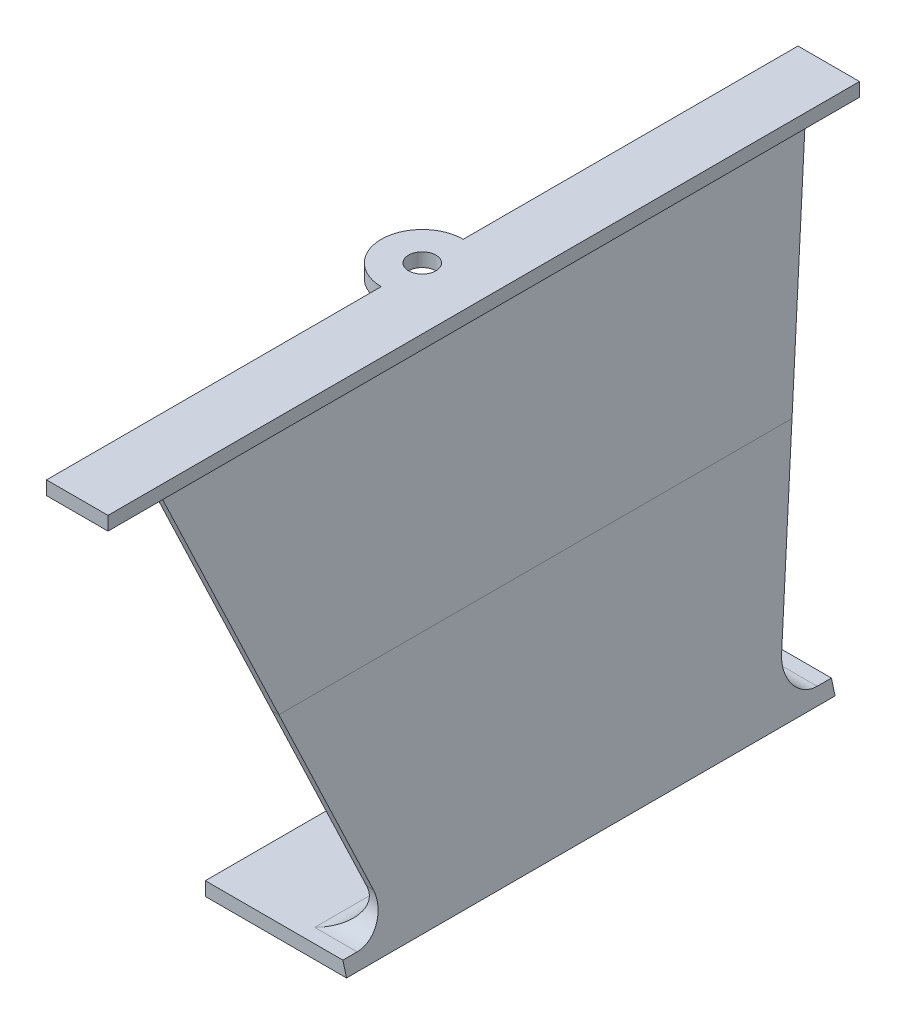
ISO-10303-21;
HEADER;
FILE_DESCRIPTION(('STEP AP214'),'2;1');
FILE_NAME('part.step','',(''),(''),'','','');
FILE_SCHEMA(('AUTOMOTIVE_DESIGN { 1 0 10303 214 1 1 1 1 }'));
ENDSEC;
DATA;
#1=APPLICATION_CONTEXT('core data for automotive mechanical design processes');
#2=APPLICATION_PROTOCOL_DEFINITION('international standard','automotive_design',2000,#1);
#3=PRODUCT_CONTEXT('',#1,'mechanical');
#4=PRODUCT('Part','Part','',(#3));
#5=PRODUCT_RELATED_PRODUCT_CATEGORY('part','',(#4));
#6=PRODUCT_DEFINITION_FORMATION('','',#4);
#7=PRODUCT_DEFINITION_CONTEXT('part definition',#1,'design');
#8=PRODUCT_DEFINITION('design','',#6,#7);
#9=PRODUCT_DEFINITION_SHAPE('','',#8);
#10=(LENGTH_UNIT() NAMED_UNIT(*) SI_UNIT(.MILLI.,.METRE.));
#11=(NAMED_UNIT(*) PLANE_ANGLE_UNIT() SI_UNIT($,.RADIAN.));
#12=(NAMED_UNIT(*) SI_UNIT($,.STERADIAN.) SOLID_ANGLE_UNIT());
#13=UNCERTAINTY_MEASURE_WITH_UNIT(LENGTH_MEASURE(1.E-05),#10,'distance_accuracy_value','');
#14=(GEOMETRIC_REPRESENTATION_CONTEXT(3) GLOBAL_UNCERTAINTY_ASSIGNED_CONTEXT((#13)) GLOBAL_UNIT_ASSIGNED_CONTEXT((#10,
#11,#12)) REPRESENTATION_CONTEXT('',''));
#15=CARTESIAN_POINT('',(0.,0.,0.));
#16=DIRECTION('',(0.,0.,1.));
#17=DIRECTION('',(1.,0.,0.));
#18=AXIS2_PLACEMENT_3D('',#15,#16,#17);
#19=CARTESIAN_POINT('',(0.,-70.5249999999999,0.));
#20=DIRECTION('',(0.,1.,0.));
#21=DIRECTION('',(0.,0.,1.));
#22=AXIS2_PLACEMENT_3D('',#19,#20,#21);
#23=PLANE('',#22);
#24=DIRECTION('',(0.,0.,-1.));
#25=VECTOR('',#24,1.);
#26=CARTESIAN_POINT('',(-42.0830751454981,-70.5249999999999,-43.3304000000001));
#27=LINE('',#26,#25);
#28=CARTESIAN_POINT('',(-42.0830751454981,-70.5249999999999,141.072171653543));
#29=VERTEX_POINT('',#28);
#30=CARTESIAN_POINT('',(-42.0830751454981,-70.5249999999999,-46.6671716535434));
#31=VERTEX_POINT('',#30);
#32=EDGE_CURVE('E202',#29,#31,#27,.T.);
#33=ORIENTED_EDGE('',*,*,#32,.T.);
#34=DIRECTION('',(-1.,0.,0.));
#35=VECTOR('',#34,1.);
#36=CARTESIAN_POINT('',(0.,-70.5249999999999,-46.6671716535434));
#37=LINE('',#36,#35);
#38=CARTESIAN_POINT('',(-44.5830751454981,-70.5249999999999,-46.6671716535434));
#39=VERTEX_POINT('',#38);
#40=EDGE_CURVE('E200',#31,#39,#37,.T.);
#41=ORIENTED_EDGE('',*,*,#40,.T.);
#42=DIRECTION('',(0.,0.,-1.));
#43=VECTOR('',#42,1.);
#44=CARTESIAN_POINT('',(-44.5830751454981,-70.5249999999999,0.));
#45=LINE('',#44,#43);
#46=CARTESIAN_POINT('',(-44.5830751454981,-70.5249999999999,141.072171653543));
#47=VERTEX_POINT('',#46);
#48=EDGE_CURVE('E197',#47,#39,#45,.T.);
#49=ORIENTED_EDGE('',*,*,#48,.F.);
#50=DIRECTION('',(-1.,0.,0.));
#51=VECTOR('',#50,1.);
#52=CARTESIAN_POINT('',(0.,-70.5249999999999,141.072171653543));
#53=LINE('',#52,#51);
#54=EDGE_CURVE('E194',#29,#47,#53,.T.);
#55=ORIENTED_EDGE('',*,*,#54,.F.);
#56=EDGE_LOOP('',(#33,#41,#49,#55));
#57=FACE_BOUND('',#56,.T.);
#58=ADVANCED_FACE('F73',(#57),#23,.T.);
#59=CARTESIAN_POINT('',(0.,-141.05,0.));
#60=DIRECTION('',(0.,1.,0.));
#61=DIRECTION('',(0.,0.,1.));
#62=AXIS2_PLACEMENT_3D('',#59,#60,#61);
#63=PLANE('',#62);
#64=DIRECTION('',(0.,0.,1.));
#65=VECTOR('',#64,1.);
#66=CARTESIAN_POINT('',(-23.1661502909963,-141.05,0.));
#67=LINE('',#66,#65);
#68=CARTESIAN_POINT('',(-23.1661502909963,-141.05,-42.1725000000001));
#69=VERTEX_POINT('',#68);
#70=CARTESIAN_POINT('',(-23.1661502909963,-141.05,-36.9542126961682));
#71=VERTEX_POINT('',#70);
#72=EDGE_CURVE('E179',#69,#71,#67,.T.);
#73=ORIENTED_EDGE('',*,*,#72,.F.);
#74=DIRECTION('',(-1.,0.,0.));
#75=VECTOR('',#74,1.);
#76=CARTESIAN_POINT('',(0.,-141.05,-42.1725000000001));
#77=LINE('',#76,#75);
#78=CARTESIAN_POINT('',(-73.5,-141.05,-42.1725000000001));
#79=VERTEX_POINT('',#78);
#80=EDGE_CURVE('E178',#69,#79,#77,.T.);
#81=ORIENTED_EDGE('',*,*,#80,.T.);
#82=DIRECTION('',(0.,0.,1.));
#83=VECTOR('',#82,1.);
#84=CARTESIAN_POINT('',(-73.5,-141.05,0.));
#85=LINE('',#84,#83);
#86=CARTESIAN_POINT('',(-73.5,-141.05,136.5775));
#87=VERTEX_POINT('',#86);
#88=EDGE_CURVE('E104',#79,#87,#85,.T.);
#89=ORIENTED_EDGE('',*,*,#88,.T.);
#90=DIRECTION('',(1.,0.,0.));
#91=VECTOR('',#90,1.);
#92=CARTESIAN_POINT('',(0.,-141.05,136.5775));
#93=LINE('',#92,#91);
#94=CARTESIAN_POINT('',(-23.1661502909963,-141.05,136.5775));
#95=VERTEX_POINT('',#94);
#96=EDGE_CURVE('E186',#87,#95,#93,.T.);
#97=ORIENTED_EDGE('',*,*,#96,.T.);
#98=CARTESIAN_POINT('',(-23.1661502909963,-141.05,131.359212696168));
#99=VERTEX_POINT('',#98);
#100=EDGE_CURVE('E295',#99,#95,#67,.T.);
#101=ORIENTED_EDGE('',*,*,#100,.F.);
#102=DIRECTION('',(-1.,0.,0.));
#103=VECTOR('',#102,1.);
#104=CARTESIAN_POINT('',(-25.6661502909962,-141.05,131.359212696168));
#105=LINE('',#104,#103);
#106=CARTESIAN_POINT('',(-38.7019399666304,-141.05,131.359212696168));
#107=VERTEX_POINT('',#106);
#108=EDGE_CURVE('E230',#99,#107,#105,.T.);
#109=ORIENTED_EDGE('',*,*,#108,.T.);
#110=DIRECTION('',(0.,0.,-1.));
#111=VECTOR('',#110,1.);
#112=CARTESIAN_POINT('',(-38.7019399666304,-141.05,-23.0618433070867));
#113=LINE('',#112,#111);
#114=CARTESIAN_POINT('',(-38.7019399666304,-141.05,-36.9542126961682));
#115=VERTEX_POINT('',#114);
#116=EDGE_CURVE('E232',#107,#115,#113,.T.);
#117=ORIENTED_EDGE('',*,*,#116,.T.);
#118=DIRECTION('',(-1.,0.,0.));
#119=VECTOR('',#118,1.);
#120=CARTESIAN_POINT('',(0.,-141.05,-36.9542126961682));
#121=LINE('',#120,#119);
#122=EDGE_CURVE('E227',#115,#71,#121,.F.);
#123=ORIENTED_EDGE('',*,*,#122,.T.);
#124=EDGE_LOOP('',(#73,#81,#89,#97,#101,#109,#117,#123));
#125=FACE_BOUND('',#124,.T.);
#126=ADVANCED_FACE('F255',(#125),#63,.T.);
#127=CARTESIAN_POINT('',(-38.7019399666304,-131.05,0.));
#128=DIRECTION('',(0.,0.,1.));
#129=DIRECTION('',(1.,0.,0.));
#130=AXIS2_PLACEMENT_3D('',#127,#128,#129);
#131=CYLINDRICAL_SURFACE('',#130,10.);
#132=DIRECTION('',(0.,0.,-1.));
#133=VECTOR('',#132,1.);
#134=CARTESIAN_POINT('',(-29.0433602264525,-128.45927859417,117.466843307087));
#135=LINE('',#134,#133);
#136=CARTESIAN_POINT('',(-29.0433602264525,-128.45927859417,-27.2956329559903));
#137=VERTEX_POINT('',#136);
#138=CARTESIAN_POINT('',(-29.0433602264525,-128.45927859417,121.70063295599));
#139=VERTEX_POINT('',#138);
#140=EDGE_CURVE('E222',#137,#139,#135,.F.);
#141=ORIENTED_EDGE('',*,*,#140,.F.);
#142=CARTESIAN_POINT('',(-38.7019399666304,-131.05,-36.9542126961682));
#143=DIRECTION('',(-0.707106781186547,0.,0.707106781186547));
#144=DIRECTION('',(0.707106781186547,0.,0.707106781186548));
#145=AXIS2_PLACEMENT_3D('',#142,#143,#144);
#146=ELLIPSE('',#145,14.142135623731,10.);
#147=EDGE_CURVE('E14',#115,#137,#146,.T.);
#148=ORIENTED_EDGE('',*,*,#147,.F.);
#149=ORIENTED_EDGE('',*,*,#116,.F.);
#150=CARTESIAN_POINT('',(-38.7019399666304,-131.05,131.359212696168));
#151=DIRECTION('',(0.707106781186547,0.,0.707106781186547));
#152=DIRECTION('',(-0.707106781186547,0.,0.707106781186548));
#153=AXIS2_PLACEMENT_3D('',#150,#151,#152);
#154=ELLIPSE('',#153,14.1421356237309,10.);
#155=EDGE_CURVE('E83',#107,#139,#154,.T.);
#156=ORIENTED_EDGE('',*,*,#155,.T.);
#157=EDGE_LOOP('',(#141,#148,#149,#156));
#158=FACE_BOUND('',#157,.T.);
#159=ADVANCED_FACE('F257',(#158),#131,.F.);
#160=CARTESIAN_POINT('',(0.,-131.05,-36.9542126961682));
#161=DIRECTION('',(-1.,0.,0.));
#162=DIRECTION('',(0.,0.,1.));
#163=AXIS2_PLACEMENT_3D('',#160,#161,#162);
#164=CYLINDRICAL_SURFACE('',#163,10.);
#165=DIRECTION('',(-1.,0.,0.));
#166=VECTOR('',#165,1.);
#167=CARTESIAN_POINT('',(0.,-127.875986855338,-27.4712996122306));
#168=LINE('',#167,#166);
#169=CARTESIAN_POINT('',(-26.6998166035065,-127.875986855338,-27.4712996122306));
#170=VERTEX_POINT('',#169);
#171=CARTESIAN_POINT('',(-29.1998166035065,-127.875986855338,-27.4712996122306));
#172=VERTEX_POINT('',#171);
#173=EDGE_CURVE('E112',#170,#172,#168,.T.);
#174=ORIENTED_EDGE('',*,*,#173,.F.);
#175=CARTESIAN_POINT('',(-25.8484508729887,-131.05,-36.9542126961682));
#176=DIRECTION('',(-0.965857974017787,-0.259072140582998,0.));
#177=DIRECTION('',(-0.259072140582997,0.965857974017787,0.));
#178=AXIS2_PLACEMENT_3D('',#175,#176,#177);
#179=ELLIPSE('',#178,10.3534890936417,10.);
#180=EDGE_CURVE('E299',#170,#71,#179,.F.);
#181=ORIENTED_EDGE('',*,*,#180,.T.);
#182=ORIENTED_EDGE('',*,*,#122,.F.);
#183=ORIENTED_EDGE('',*,*,#147,.T.);
#184=CARTESIAN_POINT('',(-28.3484508729887,-131.05,-36.9542126961682));
#185=DIRECTION('',(-0.965857974017787,-0.259072140582998,0.));
#186=DIRECTION('',(-0.259072140582998,0.965857974017787,0.));
#187=AXIS2_PLACEMENT_3D('',#184,#185,#186);
#188=ELLIPSE('',#187,10.3534890936417,10.);
#189=EDGE_CURVE('E219',#172,#137,#188,.F.);
#190=ORIENTED_EDGE('',*,*,#189,.F.);
#191=EDGE_LOOP('',(#174,#181,#182,#183,#190));
#192=FACE_BOUND('',#191,.T.);
#193=ADVANCED_FACE('F262',(#192),#164,.F.);
#194=CARTESIAN_POINT('',(0.,-21.1512430220413,-63.1929957607801));
#195=DIRECTION('',(0.,0.317401314466158,0.948291308393763));
#196=DIRECTION('',(0.,-0.948291308393763,0.317401314466158));
#197=AXIS2_PLACEMENT_3D('',#194,#195,#196);
#198=PLANE('',#197);
#199=ORIENTED_EDGE('',*,*,#40,.F.);
#200=DIRECTION('',(0.246510694172272,-0.919027106161082,0.307606332509412));
#201=VECTOR('',#200,1.);
#202=CARTESIAN_POINT('',(-51.964540399796,-33.6854849932303,-58.9976764087226));
#203=LINE('',#202,#201);
#204=EDGE_CURVE('E208',#31,#170,#203,.T.);
#205=ORIENTED_EDGE('',*,*,#204,.T.);
#206=ORIENTED_EDGE('',*,*,#173,.T.);
#207=DIRECTION('',(0.246510694172273,-0.919027106161082,0.307606332509412));
#208=VECTOR('',#207,1.);
#209=CARTESIAN_POINT('',(-63.5,0.,-70.2725000000001));
#210=LINE('',#209,#208);
#211=EDGE_CURVE('E210',#39,#172,#210,.T.);
#212=ORIENTED_EDGE('',*,*,#211,.F.);
#213=EDGE_LOOP('',(#199,#205,#206,#212));
#214=FACE_BOUND('',#213,.T.);
#215=ADVANCED_FACE('F268',(#214),#198,.F.);
#216=CARTESIAN_POINT('',(0.,-131.05,131.359212696168));
#217=DIRECTION('',(1.,0.,0.));
#218=DIRECTION('',(0.,0.,-1.));
#219=AXIS2_PLACEMENT_3D('',#216,#217,#218);
#220=CYLINDRICAL_SURFACE('',#219,10.);
#221=ORIENTED_EDGE('',*,*,#108,.F.);
#222=CARTESIAN_POINT('',(-25.8484508729887,-131.05,131.359212696168));
#223=DIRECTION('',(-0.965857974017787,-0.259072140582998,0.));
#224=DIRECTION('',(0.259072140582997,-0.965857974017787,0.));
#225=AXIS2_PLACEMENT_3D('',#222,#223,#224);
#226=ELLIPSE('',#225,10.3534890936417,10.);
#227=CARTESIAN_POINT('',(-26.6998166035065,-127.875986855338,121.87629961223));
#228=VERTEX_POINT('',#227);
#229=EDGE_CURVE('E285',#99,#228,#226,.F.);
#230=ORIENTED_EDGE('',*,*,#229,.T.);
#231=DIRECTION('',(-1.,0.,0.));
#232=VECTOR('',#231,1.);
#233=CARTESIAN_POINT('',(36.3639763779528,-127.875986855338,121.87629961223));
#234=LINE('',#233,#232);
#235=CARTESIAN_POINT('',(-29.1998166035064,-127.875986855338,121.87629961223));
#236=VERTEX_POINT('',#235);
#237=EDGE_CURVE('E224',#236,#228,#234,.F.);
#238=ORIENTED_EDGE('',*,*,#237,.F.);
#239=CARTESIAN_POINT('',(-28.3484508729887,-131.05,131.359212696168));
#240=DIRECTION('',(-0.965857974017787,-0.259072140582998,0.));
#241=DIRECTION('',(0.259072140582998,-0.965857974017787,0.));
#242=AXIS2_PLACEMENT_3D('',#239,#240,#241);
#243=ELLIPSE('',#242,10.3534890936417,10.);
#244=EDGE_CURVE('E196',#139,#236,#243,.F.);
#245=ORIENTED_EDGE('',*,*,#244,.F.);
#246=ORIENTED_EDGE('',*,*,#155,.F.);
#247=EDGE_LOOP('',(#221,#230,#238,#245,#246));
#248=FACE_BOUND('',#247,.T.);
#249=ADVANCED_FACE('F271',(#248),#220,.F.);
#250=CARTESIAN_POINT('',(-59.2379832493327,-15.8894076945745,0.));
#251=DIRECTION('',(-0.965857974017787,-0.259072140582998,0.));
#252=DIRECTION('',(0.259072140582998,-0.965857974017787,0.));
#253=AXIS2_PLACEMENT_3D('',#250,#251,#252);
#254=PLANE('',#253);
#255=DIRECTION('',(0.246510694172273,-0.919027106161083,-0.307606332509411));
#256=VECTOR('',#255,1.);
#257=CARTESIAN_POINT('',(-63.5,0.,164.6775));
#258=LINE('',#257,#256);
#259=EDGE_CURVE('E213',#47,#236,#258,.T.);
#260=ORIENTED_EDGE('',*,*,#259,.F.);
#261=ORIENTED_EDGE('',*,*,#48,.T.);
#262=ORIENTED_EDGE('',*,*,#211,.T.);
#263=ORIENTED_EDGE('',*,*,#189,.T.);
#264=ORIENTED_EDGE('',*,*,#140,.T.);
#265=ORIENTED_EDGE('',*,*,#244,.T.);
#266=EDGE_LOOP('',(#260,#261,#262,#263,#264,#265));
#267=FACE_BOUND('',#266,.T.);
#268=ADVANCED_FACE('F272',(#267),#254,.T.);
#269=CARTESIAN_POINT('',(0.,-49.5661008611077,148.087296729102));
#270=DIRECTION('',(0.,-0.317401314466157,0.948291308393763));
#271=DIRECTION('',(0.,-0.948291308393763,-0.317401314466157));
#272=AXIS2_PLACEMENT_3D('',#269,#270,#271);
#273=PLANE('',#272);
#274=DIRECTION('',(0.246510694172273,-0.919027106161083,-0.307606332509411));
#275=VECTOR('',#274,1.);
#276=CARTESIAN_POINT('',(-44.8059744058037,-60.3736423237365,144.469918992934));
#277=LINE('',#276,#275);
#278=EDGE_CURVE('E280',#29,#228,#277,.T.);
#279=ORIENTED_EDGE('',*,*,#278,.F.);
#280=ORIENTED_EDGE('',*,*,#54,.T.);
#281=ORIENTED_EDGE('',*,*,#259,.T.);
#282=ORIENTED_EDGE('',*,*,#237,.T.);
#283=EDGE_LOOP('',(#279,#280,#281,#282));
#284=FACE_BOUND('',#283,.T.);
#285=ADVANCED_FACE('F252',(#284),#273,.T.);
#286=CARTESIAN_POINT('',(0.,-141.05,-42.1725000000001));
#287=DIRECTION('',(0.,0.,1.));
#288=DIRECTION('',(1.,0.,0.));
#289=AXIS2_PLACEMENT_3D('',#286,#287,#288);
#290=PLANE('',#289);
#291=ORIENTED_EDGE('',*,*,#80,.F.);
#292=DIRECTION('',(0.259072140582997,-0.965857974017787,0.));
#293=VECTOR('',#292,1.);
#294=CARTESIAN_POINT('',(-21.6112759510167,-146.846793806101,-42.1725000000001));
#295=LINE('',#294,#293);
#296=CARTESIAN_POINT('',(-21.825,-146.05,-42.1725000000001));
#297=VERTEX_POINT('',#296);
#298=EDGE_CURVE('E167',#69,#297,#295,.T.);
#299=ORIENTED_EDGE('',*,*,#298,.T.);
#300=DIRECTION('',(-1.,0.,0.));
#301=VECTOR('',#300,1.);
#302=CARTESIAN_POINT('',(0.,-146.05,-42.1725000000001));
#303=LINE('',#302,#301);
#304=CARTESIAN_POINT('',(-73.5,-146.05,-42.1725000000001));
#305=VERTEX_POINT('',#304);
#306=EDGE_CURVE('E92',#297,#305,#303,.T.);
#307=ORIENTED_EDGE('',*,*,#306,.T.);
#308=DIRECTION('',(0.,-1.,0.));
#309=VECTOR('',#308,1.);
#310=CARTESIAN_POINT('',(-73.5,-141.05,-42.1725000000001));
#311=LINE('',#310,#309);
#312=EDGE_CURVE('E212',#79,#305,#311,.T.);
#313=ORIENTED_EDGE('',*,*,#312,.F.);
#314=EDGE_LOOP('',(#291,#299,#307,#313));
#315=FACE_BOUND('',#314,.T.);
#316=ADVANCED_FACE('F177',(#315),#290,.F.);
#317=CARTESIAN_POINT('',(-73.5,-141.05,0.));
#318=DIRECTION('',(1.,0.,0.));
#319=DIRECTION('',(0.,0.,-1.));
#320=AXIS2_PLACEMENT_3D('',#317,#318,#319);
#321=PLANE('',#320);
#322=DIRECTION('',(0.,0.,1.));
#323=VECTOR('',#322,1.);
#324=CARTESIAN_POINT('',(-73.5,-146.05,0.));
#325=LINE('',#324,#323);
#326=CARTESIAN_POINT('',(-73.5,-146.05,136.5775));
#327=VERTEX_POINT('',#326);
#328=EDGE_CURVE('E183',#305,#327,#325,.T.);
#329=ORIENTED_EDGE('',*,*,#328,.T.);
#330=DIRECTION('',(0.,-1.,0.));
#331=VECTOR('',#330,1.);
#332=CARTESIAN_POINT('',(-73.5,-141.05,136.5775));
#333=LINE('',#332,#331);
#334=EDGE_CURVE('E191',#87,#327,#333,.T.);
#335=ORIENTED_EDGE('',*,*,#334,.F.);
#336=ORIENTED_EDGE('',*,*,#88,.F.);
#337=ORIENTED_EDGE('',*,*,#312,.T.);
#338=EDGE_LOOP('',(#329,#335,#336,#337));
#339=FACE_BOUND('',#338,.T.);
#340=ADVANCED_FACE('F242',(#339),#321,.F.);
#341=CARTESIAN_POINT('',(0.,-141.05,136.5775));
#342=DIRECTION('',(0.,0.,-1.));
#343=DIRECTION('',(-1.,0.,0.));
#344=AXIS2_PLACEMENT_3D('',#341,#342,#343);
#345=PLANE('',#344);
#346=DIRECTION('',(1.,0.,0.));
#347=VECTOR('',#346,1.);
#348=CARTESIAN_POINT('',(0.,-146.05,136.5775));
#349=LINE('',#348,#347);
#350=CARTESIAN_POINT('',(-21.825,-146.05,136.5775));
#351=VERTEX_POINT('',#350);
#352=EDGE_CURVE('E174',#327,#351,#349,.T.);
#353=ORIENTED_EDGE('',*,*,#352,.T.);
#354=DIRECTION('',(-0.259072140582997,0.965857974017787,0.));
#355=VECTOR('',#354,1.);
#356=CARTESIAN_POINT('',(-21.6112759510167,-146.846793806101,136.5775));
#357=LINE('',#356,#355);
#358=EDGE_CURVE('E170',#351,#95,#357,.T.);
#359=ORIENTED_EDGE('',*,*,#358,.T.);
#360=ORIENTED_EDGE('',*,*,#96,.F.);
#361=ORIENTED_EDGE('',*,*,#334,.T.);
#362=EDGE_LOOP('',(#353,#359,#360,#361));
#363=FACE_BOUND('',#362,.T.);
#364=ADVANCED_FACE('F240',(#363),#345,.F.);
#365=CARTESIAN_POINT('',(-41.4125,-73.0249999999999,-43.3304000000001));
#366=DIRECTION('',(-0.965857974017787,-0.259072140582998,0.));
#367=DIRECTION('',(0.259072140582998,-0.965857974017787,0.));
#368=AXIS2_PLACEMENT_3D('',#365,#366,#367);
#369=PLANE('',#368);
#370=ORIENTED_EDGE('',*,*,#32,.F.);
#371=ORIENTED_EDGE('',*,*,#278,.T.);
#372=ORIENTED_EDGE('',*,*,#229,.F.);
#373=ORIENTED_EDGE('',*,*,#100,.T.);
#374=ORIENTED_EDGE('',*,*,#358,.F.);
#375=DIRECTION('',(0.,0.,-1.));
#376=VECTOR('',#375,1.);
#377=CARTESIAN_POINT('',(-21.825,-146.05,-18.8883000000001));
#378=LINE('',#377,#376);
#379=EDGE_CURVE('E166',#351,#297,#378,.T.);
#380=ORIENTED_EDGE('',*,*,#379,.T.);
#381=ORIENTED_EDGE('',*,*,#298,.F.);
#382=ORIENTED_EDGE('',*,*,#72,.T.);
#383=ORIENTED_EDGE('',*,*,#180,.F.);
#384=ORIENTED_EDGE('',*,*,#204,.F.);
#385=EDGE_LOOP('',(#370,#371,#372,#373,#374,#380,#381,#382,#383,#384));
#386=FACE_BOUND('',#385,.T.);
#387=ADVANCED_FACE('F75',(#386),#369,.F.);
#388=CARTESIAN_POINT('',(0.,-146.05,0.));
#389=DIRECTION('',(0.,-1.,0.));
#390=DIRECTION('',(0.,0.,-1.));
#391=AXIS2_PLACEMENT_3D('',#388,#389,#390);
#392=PLANE('',#391);
#393=ORIENTED_EDGE('',*,*,#379,.F.);
#394=ORIENTED_EDGE('',*,*,#352,.F.);
#395=ORIENTED_EDGE('',*,*,#328,.F.);
#396=ORIENTED_EDGE('',*,*,#306,.F.);
#397=EDGE_LOOP('',(#393,#394,#395,#396));
#398=FACE_BOUND('',#397,.T.);
#399=ADVANCED_FACE('F182',(#398),#392,.T.);
#400=CLOSED_SHELL('',(#58,#126,#159,#193,#215,#249,#268,#285,#316,#340,#364,#387,#399));
#401=MANIFOLD_SOLID_BREP('B2',#400);
#402=CARTESIAN_POINT('',(0.,-70.5249999999999,0.));
#403=DIRECTION('',(0.,1.,0.));
#404=DIRECTION('',(0.,0.,1.));
#405=AXIS2_PLACEMENT_3D('',#402,#403,#404);
#406=PLANE('',#405);
#407=DIRECTION('',(-1.,0.,0.));
#408=VECTOR('',#407,1.);
#409=CARTESIAN_POINT('',(0.,-70.5249999999999,-46.6671716535434));
#410=LINE('',#409,#408);
#411=CARTESIAN_POINT('',(-42.0830751454981,-70.5249999999999,-46.6671716535434));
#412=VERTEX_POINT('',#411);
#413=CARTESIAN_POINT('',(-44.5830751454981,-70.5249999999999,-46.6671716535434));
#414=VERTEX_POINT('',#413);
#415=EDGE_CURVE('E539',#412,#414,#410,.T.);
#416=ORIENTED_EDGE('',*,*,#415,.F.);
#417=DIRECTION('',(0.,0.,-1.));
#418=VECTOR('',#417,1.);
#419=CARTESIAN_POINT('',(-42.0830751454981,-70.5249999999999,-43.3304000000001));
#420=LINE('',#419,#418);
#421=CARTESIAN_POINT('',(-42.0830751454981,-70.5249999999999,141.072171653543));
#422=VERTEX_POINT('',#421);
#423=EDGE_CURVE('E521',#422,#412,#420,.T.);
#424=ORIENTED_EDGE('',*,*,#423,.F.);
#425=DIRECTION('',(-1.,0.,0.));
#426=VECTOR('',#425,1.);
#427=CARTESIAN_POINT('',(0.,-70.5249999999999,141.072171653543));
#428=LINE('',#427,#426);
#429=CARTESIAN_POINT('',(-44.5830751454981,-70.5249999999999,141.072171653543));
#430=VERTEX_POINT('',#429);
#431=EDGE_CURVE('E71',#422,#430,#428,.T.);
#432=ORIENTED_EDGE('',*,*,#431,.T.);
#433=DIRECTION('',(0.,0.,-1.));
#434=VECTOR('',#433,1.);
#435=CARTESIAN_POINT('',(-44.5830751454981,-70.5249999999999,0.));
#436=LINE('',#435,#434);
#437=EDGE_CURVE('E402',#430,#414,#436,.T.);
#438=ORIENTED_EDGE('',*,*,#437,.T.);
#439=EDGE_LOOP('',(#416,#424,#432,#438));
#440=FACE_BOUND('',#439,.T.);
#441=ADVANCED_FACE('F393',(#440),#406,.F.);
#442=CARTESIAN_POINT('',(0.,-21.1512430220413,-63.1929957607801));
#443=DIRECTION('',(0.,0.317401314466158,0.948291308393763));
#444=DIRECTION('',(0.,-0.948291308393763,0.317401314466158));
#445=AXIS2_PLACEMENT_3D('',#442,#443,#444);
#446=PLANE('',#445);
#447=DIRECTION('',(-1.,0.,0.));
#448=VECTOR('',#447,1.);
#449=CARTESIAN_POINT('',(-63.5,0.,-70.2725000000001));
#450=LINE('',#449,#448);
#451=CARTESIAN_POINT('',(-61.,0.,-70.2725000000001));
#452=VERTEX_POINT('',#451);
#453=CARTESIAN_POINT('',(-63.5,0.,-70.2725000000001));
#454=VERTEX_POINT('',#453);
#455=EDGE_CURVE('E396',#452,#454,#450,.T.);
#456=ORIENTED_EDGE('',*,*,#455,.F.);
#457=DIRECTION('',(0.246510694172272,-0.919027106161082,0.307606332509412));
#458=VECTOR('',#457,1.);
#459=CARTESIAN_POINT('',(-51.964540399796,-33.6854849932303,-58.9976764087226));
#460=LINE('',#459,#458);
#461=EDGE_CURVE('E550',#452,#412,#460,.T.);
#462=ORIENTED_EDGE('',*,*,#461,.T.);
#463=ORIENTED_EDGE('',*,*,#415,.T.);
#464=DIRECTION('',(0.246510694172273,-0.919027106161082,0.307606332509412));
#465=VECTOR('',#464,1.);
#466=CARTESIAN_POINT('',(-63.5,0.,-70.2725000000001));
#467=LINE('',#466,#465);
#468=EDGE_CURVE('E513',#454,#414,#467,.T.);
#469=ORIENTED_EDGE('',*,*,#468,.F.);
#470=EDGE_LOOP('',(#456,#462,#463,#469));
#471=FACE_BOUND('',#470,.T.);
#472=ADVANCED_FACE('F547',(#471),#446,.F.);
#473=CARTESIAN_POINT('',(-59.2379832493327,-15.8894076945745,0.));
#474=DIRECTION('',(-0.965857974017787,-0.259072140582998,0.));
#475=DIRECTION('',(0.259072140582998,-0.965857974017787,0.));
#476=AXIS2_PLACEMENT_3D('',#473,#474,#475);
#477=PLANE('',#476);
#478=ORIENTED_EDGE('',*,*,#437,.F.);
#479=DIRECTION('',(0.246510694172273,-0.919027106161083,-0.307606332509411));
#480=VECTOR('',#479,1.);
#481=CARTESIAN_POINT('',(-63.5,0.,164.6775));
#482=LINE('',#481,#480);
#483=CARTESIAN_POINT('',(-63.5,0.,164.6775));
#484=VERTEX_POINT('',#483);
#485=EDGE_CURVE('E516',#484,#430,#482,.T.);
#486=ORIENTED_EDGE('',*,*,#485,.F.);
#487=DIRECTION('',(0.,0.,1.));
#488=VECTOR('',#487,1.);
#489=CARTESIAN_POINT('',(-63.5,0.,-70.2725000000001));
#490=LINE('',#489,#488);
#491=EDGE_CURVE('E512',#454,#484,#490,.T.);
#492=ORIENTED_EDGE('',*,*,#491,.F.);
#493=ORIENTED_EDGE('',*,*,#468,.T.);
#494=EDGE_LOOP('',(#478,#486,#492,#493));
#495=FACE_BOUND('',#494,.T.);
#496=ADVANCED_FACE('F553',(#495),#477,.T.);
#497=CARTESIAN_POINT('',(0.,-49.5661008611077,148.087296729102));
#498=DIRECTION('',(0.,-0.317401314466157,0.948291308393763));
#499=DIRECTION('',(0.,-0.948291308393763,-0.317401314466157));
#500=AXIS2_PLACEMENT_3D('',#497,#498,#499);
#501=PLANE('',#500);
#502=DIRECTION('',(0.246510694172273,-0.919027106161083,-0.307606332509411));
#503=VECTOR('',#502,1.);
#504=CARTESIAN_POINT('',(-44.8059744058037,-60.3736423237365,144.469918992934));
#505=LINE('',#504,#503);
#506=CARTESIAN_POINT('',(-61.,0.,164.6775));
#507=VERTEX_POINT('',#506);
#508=EDGE_CURVE('E560',#507,#422,#505,.T.);
#509=ORIENTED_EDGE('',*,*,#508,.F.);
#510=DIRECTION('',(1.,0.,0.));
#511=VECTOR('',#510,1.);
#512=CARTESIAN_POINT('',(-63.5,0.,164.6775));
#513=LINE('',#512,#511);
#514=EDGE_CURVE('E529',#484,#507,#513,.T.);
#515=ORIENTED_EDGE('',*,*,#514,.F.);
#516=ORIENTED_EDGE('',*,*,#485,.T.);
#517=ORIENTED_EDGE('',*,*,#431,.F.);
#518=EDGE_LOOP('',(#509,#515,#516,#517));
#519=FACE_BOUND('',#518,.T.);
#520=ADVANCED_FACE('F598',(#519),#501,.T.);
#521=CARTESIAN_POINT('',(-41.4125,-73.0249999999999,-43.3304000000001));
#522=DIRECTION('',(-0.965857974017787,-0.259072140582998,0.));
#523=DIRECTION('',(0.259072140582998,-0.965857974017787,0.));
#524=AXIS2_PLACEMENT_3D('',#521,#522,#523);
#525=PLANE('',#524);
#526=DIRECTION('',(0.,0.,1.));
#527=VECTOR('',#526,1.);
#528=CARTESIAN_POINT('',(-61.,0.,0.));
#529=LINE('',#528,#527);
#530=EDGE_CURVE('E508',#452,#507,#529,.T.);
#531=ORIENTED_EDGE('',*,*,#530,.T.);
#532=ORIENTED_EDGE('',*,*,#508,.T.);
#533=ORIENTED_EDGE('',*,*,#423,.T.);
#534=ORIENTED_EDGE('',*,*,#461,.F.);
#535=EDGE_LOOP('',(#531,#532,#533,#534));
#536=FACE_BOUND('',#535,.T.);
#537=ADVANCED_FACE('F600',(#536),#525,.F.);
#538=CARTESIAN_POINT('',(0.,0.,0.));
#539=DIRECTION('',(0.,1.,0.));
#540=DIRECTION('',(0.,0.,1.));
#541=AXIS2_PLACEMENT_3D('',#538,#539,#540);
#542=PLANE('',#541);
#543=CARTESIAN_POINT('',(-83.5,0.,47.2024999999999));
#544=DIRECTION('',(0.,1.,0.));
#545=DIRECTION('',(0.,0.,1.));
#546=AXIS2_PLACEMENT_3D('',#543,#544,#545);
#547=CIRCLE('',#546,5.00000000000001);
#548=CARTESIAN_POINT('',(-83.5,0.,52.2024999999999));
#549=VERTEX_POINT('',#548);
#550=EDGE_CURVE('E504',#549,#549,#547,.F.);
#551=ORIENTED_EDGE('',*,*,#550,.F.);
#552=EDGE_LOOP('',(#551));
#553=FACE_BOUND('',#552,.T.);
#554=DIRECTION('',(1.,0.,0.));
#555=VECTOR('',#554,1.);
#556=CARTESIAN_POINT('',(0.,0.,-90.2725000000001));
#557=LINE('',#556,#555);
#558=CARTESIAN_POINT('',(-83.5,0.,-90.2725000000001));
#559=VERTEX_POINT('',#558);
#560=CARTESIAN_POINT('',(-61.,0.,-90.2725000000001));
#561=VERTEX_POINT('',#560);
#562=EDGE_CURVE('E500',#559,#561,#557,.T.);
#563=ORIENTED_EDGE('',*,*,#562,.T.);
#564=DIRECTION('',(0.,0.,1.));
#565=VECTOR('',#564,1.);
#566=CARTESIAN_POINT('',(-61.,0.,-90.2725000000001));
#567=LINE('',#566,#565);
#568=EDGE_CURVE('E557',#561,#452,#567,.T.);
#569=ORIENTED_EDGE('',*,*,#568,.T.);
#570=ORIENTED_EDGE('',*,*,#455,.T.);
#571=ORIENTED_EDGE('',*,*,#491,.T.);
#572=ORIENTED_EDGE('',*,*,#514,.T.);
#573=CARTESIAN_POINT('',(-61.,0.,184.6775));
#574=VERTEX_POINT('',#573);
#575=EDGE_CURVE('E561',#507,#574,#567,.T.);
#576=ORIENTED_EDGE('',*,*,#575,.T.);
#577=DIRECTION('',(1.,0.,0.));
#578=VECTOR('',#577,1.);
#579=CARTESIAN_POINT('',(-1.19463333478565E-13,0.,184.6775));
#580=LINE('',#579,#578);
#581=CARTESIAN_POINT('',(-83.5,0.,184.6775));
#582=VERTEX_POINT('',#581);
#583=EDGE_CURVE('E487',#582,#574,#580,.T.);
#584=ORIENTED_EDGE('',*,*,#583,.F.);
#585=DIRECTION('',(0.,0.,1.));
#586=VECTOR('',#585,1.);
#587=CARTESIAN_POINT('',(-83.5,0.,0.));
#588=LINE('',#587,#586);
#589=CARTESIAN_POINT('',(-83.5,0.,62.2024999999998));
#590=VERTEX_POINT('',#589);
#591=EDGE_CURVE('E503',#590,#582,#588,.T.);
#592=ORIENTED_EDGE('',*,*,#591,.F.);
#593=CARTESIAN_POINT('',(-83.5,0.,47.2024999999999));
#594=DIRECTION('',(0.,1.,0.));
#595=DIRECTION('',(0.,0.,1.));
#596=AXIS2_PLACEMENT_3D('',#593,#594,#595);
#597=CIRCLE('',#596,14.9999999999999);
#598=CARTESIAN_POINT('',(-83.5,0.,32.2025));
#599=VERTEX_POINT('',#598);
#600=EDGE_CURVE('E571',#590,#599,#597,.F.);
#601=ORIENTED_EDGE('',*,*,#600,.T.);
#602=EDGE_CURVE('E505',#559,#599,#588,.T.);
#603=ORIENTED_EDGE('',*,*,#602,.F.);
#604=EDGE_LOOP('',(#563,#569,#570,#571,#572,#576,#584,#592,#601,#603));
#605=FACE_BOUND('',#604,.T.);
#606=ADVANCED_FACE('F555',(#553,#605),#542,.F.);
#607=CARTESIAN_POINT('',(-83.5,5.,0.));
#608=DIRECTION('',(1.,0.,0.));
#609=DIRECTION('',(0.,0.,-1.));
#610=AXIS2_PLACEMENT_3D('',#607,#608,#609);
#611=PLANE('',#610);
#612=ORIENTED_EDGE('',*,*,#602,.T.);
#613=DIRECTION('',(0.,1.,0.));
#614=VECTOR('',#613,1.);
#615=CARTESIAN_POINT('',(-83.5,-33.5410196624969,32.2025));
#616=LINE('',#615,#614);
#617=CARTESIAN_POINT('',(-83.5,5.,32.2025));
#618=VERTEX_POINT('',#617);
#619=EDGE_CURVE('E581',#599,#618,#616,.T.);
#620=ORIENTED_EDGE('',*,*,#619,.T.);
#621=DIRECTION('',(0.,0.,1.));
#622=VECTOR('',#621,1.);
#623=CARTESIAN_POINT('',(-83.5,5.,0.));
#624=LINE('',#623,#622);
#625=CARTESIAN_POINT('',(-83.5,5.,-90.2725000000001));
#626=VERTEX_POINT('',#625);
#627=EDGE_CURVE('E494',#626,#618,#624,.T.);
#628=ORIENTED_EDGE('',*,*,#627,.F.);
#629=DIRECTION('',(0.,-1.,0.));
#630=VECTOR('',#629,1.);
#631=CARTESIAN_POINT('',(-83.5,5.,-90.2725000000001));
#632=LINE('',#631,#630);
#633=EDGE_CURVE('E510',#626,#559,#632,.T.);
#634=ORIENTED_EDGE('',*,*,#633,.T.);
#635=EDGE_LOOP('',(#612,#620,#628,#634));
#636=FACE_BOUND('',#635,.T.);
#637=ADVANCED_FACE('F607',(#636),#611,.F.);
#638=CARTESIAN_POINT('',(-61.,5.,0.));
#639=DIRECTION('',(1.,0.,0.));
#640=DIRECTION('',(0.,0.,-1.));
#641=AXIS2_PLACEMENT_3D('',#638,#639,#640);
#642=PLANE('',#641);
#643=ORIENTED_EDGE('',*,*,#530,.F.);
#644=ORIENTED_EDGE('',*,*,#568,.F.);
#645=DIRECTION('',(0.,-1.,0.));
#646=VECTOR('',#645,1.);
#647=CARTESIAN_POINT('',(-61.,0.,-90.2725000000001));
#648=LINE('',#647,#646);
#649=CARTESIAN_POINT('',(-61.,5.,-90.2725000000001));
#650=VERTEX_POINT('',#649);
#651=EDGE_CURVE('E476',#650,#561,#648,.T.);
#652=ORIENTED_EDGE('',*,*,#651,.F.);
#653=DIRECTION('',(0.,0.,1.));
#654=VECTOR('',#653,1.);
#655=CARTESIAN_POINT('',(-61.,5.,0.));
#656=LINE('',#655,#654);
#657=CARTESIAN_POINT('',(-61.,5.,184.6775));
#658=VERTEX_POINT('',#657);
#659=EDGE_CURVE('E410',#650,#658,#656,.T.);
#660=ORIENTED_EDGE('',*,*,#659,.T.);
#661=DIRECTION('',(0.,-1.,0.));
#662=VECTOR('',#661,1.);
#663=CARTESIAN_POINT('',(-61.,0.,184.6775));
#664=LINE('',#663,#662);
#665=EDGE_CURVE('E473',#658,#574,#664,.T.);
#666=ORIENTED_EDGE('',*,*,#665,.T.);
#667=ORIENTED_EDGE('',*,*,#575,.F.);
#668=EDGE_LOOP('',(#643,#644,#652,#660,#666,#667));
#669=FACE_BOUND('',#668,.T.);
#670=ADVANCED_FACE('F471',(#669),#642,.T.);
#671=CARTESIAN_POINT('',(0.,5.,-90.2725000000001));
#672=DIRECTION('',(0.,0.,-1.));
#673=DIRECTION('',(-1.,0.,0.));
#674=AXIS2_PLACEMENT_3D('',#671,#672,#673);
#675=PLANE('',#674);
#676=ORIENTED_EDGE('',*,*,#651,.T.);
#677=ORIENTED_EDGE('',*,*,#562,.F.);
#678=ORIENTED_EDGE('',*,*,#633,.F.);
#679=DIRECTION('',(1.,0.,0.));
#680=VECTOR('',#679,1.);
#681=CARTESIAN_POINT('',(0.,5.,-90.2725000000001));
#682=LINE('',#681,#680);
#683=EDGE_CURVE('E525',#626,#650,#682,.T.);
#684=ORIENTED_EDGE('',*,*,#683,.T.);
#685=EDGE_LOOP('',(#676,#677,#678,#684));
#686=FACE_BOUND('',#685,.T.);
#687=ADVANCED_FACE('F585',(#686),#675,.T.);
#688=CARTESIAN_POINT('',(-83.5,5.,62.2024999999998));
#689=VERTEX_POINT('',#688);
#690=CARTESIAN_POINT('',(-83.5,5.,184.6775));
#691=VERTEX_POINT('',#690);
#692=EDGE_CURVE('E492',#689,#691,#624,.T.);
#693=ORIENTED_EDGE('',*,*,#692,.F.);
#694=DIRECTION('',(0.,1.,0.));
#695=VECTOR('',#694,1.);
#696=CARTESIAN_POINT('',(-83.5,-33.5410196624969,62.2024999999998));
#697=LINE('',#696,#695);
#698=EDGE_CURVE('E574',#590,#689,#697,.T.);
#699=ORIENTED_EDGE('',*,*,#698,.F.);
#700=ORIENTED_EDGE('',*,*,#591,.T.);
#701=DIRECTION('',(0.,-1.,0.));
#702=VECTOR('',#701,1.);
#703=CARTESIAN_POINT('',(-83.5,5.,184.6775));
#704=LINE('',#703,#702);
#705=EDGE_CURVE('E478',#691,#582,#704,.T.);
#706=ORIENTED_EDGE('',*,*,#705,.F.);
#707=EDGE_LOOP('',(#693,#699,#700,#706));
#708=FACE_BOUND('',#707,.T.);
#709=ADVANCED_FACE('F595',(#708),#611,.F.);
#710=CARTESIAN_POINT('',(-1.19463333478565E-13,5.,184.6775));
#711=DIRECTION('',(0.,0.,-1.));
#712=DIRECTION('',(-1.,0.,0.));
#713=AXIS2_PLACEMENT_3D('',#710,#711,#712);
#714=PLANE('',#713);
#715=ORIENTED_EDGE('',*,*,#583,.T.);
#716=ORIENTED_EDGE('',*,*,#665,.F.);
#717=DIRECTION('',(1.,0.,0.));
#718=VECTOR('',#717,1.);
#719=CARTESIAN_POINT('',(-1.19463333478565E-13,5.,184.6775));
#720=LINE('',#719,#718);
#721=EDGE_CURVE('E479',#691,#658,#720,.T.);
#722=ORIENTED_EDGE('',*,*,#721,.F.);
#723=ORIENTED_EDGE('',*,*,#705,.T.);
#724=EDGE_LOOP('',(#715,#716,#722,#723));
#725=FACE_BOUND('',#724,.T.);
#726=ADVANCED_FACE('F484',(#725),#714,.F.);
#727=CARTESIAN_POINT('',(0.,5.,0.));
#728=DIRECTION('',(0.,1.,0.));
#729=DIRECTION('',(0.,0.,1.));
#730=AXIS2_PLACEMENT_3D('',#727,#728,#729);
#731=PLANE('',#730);
#732=ORIENTED_EDGE('',*,*,#659,.F.);
#733=ORIENTED_EDGE('',*,*,#683,.F.);
#734=ORIENTED_EDGE('',*,*,#627,.T.);
#735=CARTESIAN_POINT('',(-83.5,5.,47.2024999999999));
#736=DIRECTION('',(0.,1.,0.));
#737=DIRECTION('',(0.,0.,1.));
#738=AXIS2_PLACEMENT_3D('',#735,#736,#737);
#739=CIRCLE('',#738,14.9999999999999);
#740=EDGE_CURVE('E579',#618,#689,#739,.T.);
#741=ORIENTED_EDGE('',*,*,#740,.T.);
#742=ORIENTED_EDGE('',*,*,#692,.T.);
#743=ORIENTED_EDGE('',*,*,#721,.T.);
#744=EDGE_LOOP('',(#732,#733,#734,#741,#742,#743));
#745=FACE_BOUND('',#744,.T.);
#746=CARTESIAN_POINT('',(-83.5,5.,47.2024999999999));
#747=DIRECTION('',(0.,1.,0.));
#748=DIRECTION('',(0.,0.,1.));
#749=AXIS2_PLACEMENT_3D('',#746,#747,#748);
#750=CIRCLE('',#749,5.00000000000001);
#751=CARTESIAN_POINT('',(-83.5,5.,52.2024999999999));
#752=VERTEX_POINT('',#751);
#753=EDGE_CURVE('E570',#752,#752,#750,.T.);
#754=ORIENTED_EDGE('',*,*,#753,.F.);
#755=EDGE_LOOP('',(#754));
#756=FACE_BOUND('',#755,.T.);
#757=ADVANCED_FACE('F489',(#745,#756),#731,.T.);
#758=CARTESIAN_POINT('',(-83.5,-33.5410196624969,47.2024999999999));
#759=DIRECTION('',(0.,1.,0.));
#760=DIRECTION('',(0.,0.,1.));
#761=AXIS2_PLACEMENT_3D('',#758,#759,#760);
#762=CYLINDRICAL_SURFACE('',#761,5.00000000000001);
#763=ORIENTED_EDGE('',*,*,#753,.T.);
#764=EDGE_LOOP('',(#763));
#765=FACE_BOUND('',#764,.T.);
#766=ORIENTED_EDGE('',*,*,#550,.T.);
#767=EDGE_LOOP('',(#766));
#768=FACE_BOUND('',#767,.T.);
#769=ADVANCED_FACE('F618',(#765,#768),#762,.F.);
#770=CARTESIAN_POINT('',(-83.5,-33.5410196624969,47.2024999999999));
#771=DIRECTION('',(0.,1.,0.));
#772=DIRECTION('',(0.,0.,1.));
#773=AXIS2_PLACEMENT_3D('',#770,#771,#772);
#774=CYLINDRICAL_SURFACE('',#773,14.9999999999999);
#775=ORIENTED_EDGE('',*,*,#600,.F.);
#776=ORIENTED_EDGE('',*,*,#698,.T.);
#777=ORIENTED_EDGE('',*,*,#740,.F.);
#778=ORIENTED_EDGE('',*,*,#619,.F.);
#779=EDGE_LOOP('',(#775,#776,#777,#778));
#780=FACE_BOUND('',#779,.T.);
#781=ADVANCED_FACE('F592',(#780),#774,.T.);
#782=CLOSED_SHELL('',(#441,#472,#496,#520,#537,#606,#637,#670,#687,#709,#726,#757,#769,#781));
#783=MANIFOLD_SOLID_BREP('B8',#782);
#784=ADVANCED_BREP_SHAPE_REPRESENTATION('',(#18,#401,#783),#14);
#785=SHAPE_DEFINITION_REPRESENTATION(#9,#784);
ENDSEC;
END-ISO-10303-21;
